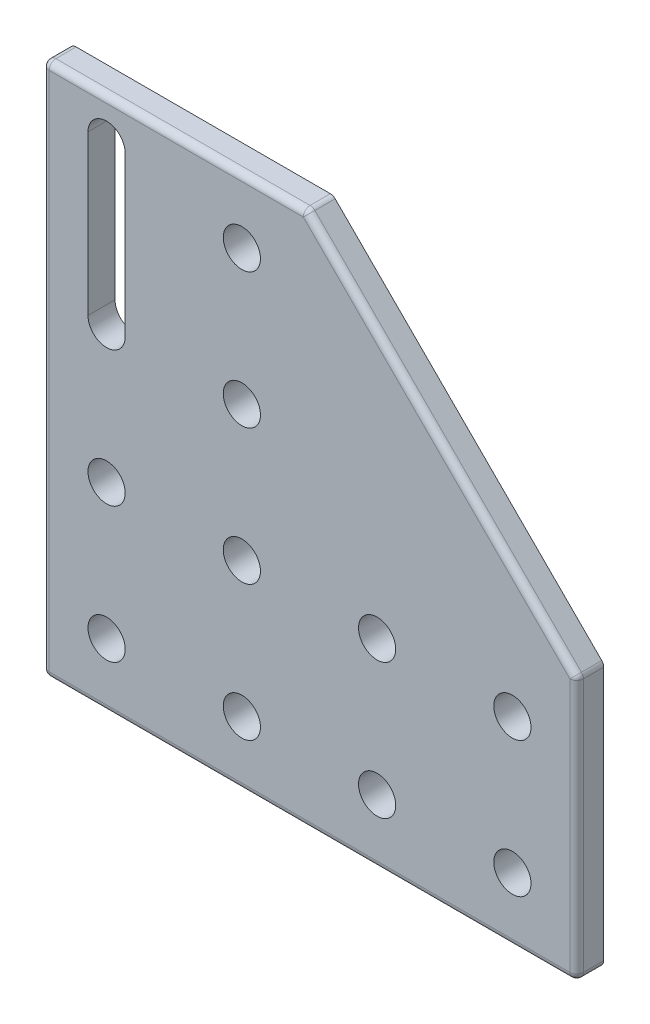
ISO-10303-21;
HEADER;
FILE_DESCRIPTION(('STEP AP214'),'2;1');
FILE_NAME('part.step','',(''),(''),'','','');
FILE_SCHEMA(('AUTOMOTIVE_DESIGN { 1 0 10303 214 1 1 1 1 }'));
ENDSEC;
DATA;
#1=APPLICATION_CONTEXT('core data for automotive mechanical design processes');
#2=APPLICATION_PROTOCOL_DEFINITION('international standard','automotive_design',2000,#1);
#3=PRODUCT_CONTEXT('',#1,'mechanical');
#4=PRODUCT('Part','Part','',(#3));
#5=PRODUCT_RELATED_PRODUCT_CATEGORY('part','',(#4));
#6=PRODUCT_DEFINITION_FORMATION('','',#4);
#7=PRODUCT_DEFINITION_CONTEXT('part definition',#1,'design');
#8=PRODUCT_DEFINITION('design','',#6,#7);
#9=PRODUCT_DEFINITION_SHAPE('','',#8);
#10=(LENGTH_UNIT() NAMED_UNIT(*) SI_UNIT(.MILLI.,.METRE.));
#11=(NAMED_UNIT(*) PLANE_ANGLE_UNIT() SI_UNIT($,.RADIAN.));
#12=(NAMED_UNIT(*) SI_UNIT($,.STERADIAN.) SOLID_ANGLE_UNIT());
#13=UNCERTAINTY_MEASURE_WITH_UNIT(LENGTH_MEASURE(1.E-05),#10,'distance_accuracy_value','');
#14=(GEOMETRIC_REPRESENTATION_CONTEXT(3) GLOBAL_UNCERTAINTY_ASSIGNED_CONTEXT((#13)) GLOBAL_UNIT_ASSIGNED_CONTEXT((#10,
#11,#12)) REPRESENTATION_CONTEXT('',''));
#15=CARTESIAN_POINT('',(0.,0.,0.));
#16=DIRECTION('',(0.,0.,1.));
#17=DIRECTION('',(1.,0.,0.));
#18=AXIS2_PLACEMENT_3D('',#15,#16,#17);
#19=CARTESIAN_POINT('',(0.,0.,2.));
#20=DIRECTION('',(0.,0.,-1.));
#21=DIRECTION('',(-1.,0.,0.));
#22=AXIS2_PLACEMENT_3D('',#19,#20,#21);
#23=PLANE('',#22);
#24=DIRECTION('',(0.,-1.,0.));
#25=VECTOR('',#24,1.);
#26=CARTESIAN_POINT('',(1.,0.,2.));
#27=LINE('',#26,#25);
#28=CARTESIAN_POINT('',(1.,78.,2.));
#29=VERTEX_POINT('',#28);
#30=CARTESIAN_POINT('',(1.,1.,2.));
#31=VERTEX_POINT('',#30);
#32=EDGE_CURVE('E287',#29,#31,#27,.T.);
#33=ORIENTED_EDGE('',*,*,#32,.T.);
#34=DIRECTION('',(1.,0.,0.));
#35=VECTOR('',#34,1.);
#36=CARTESIAN_POINT('',(0.,1.,2.));
#37=LINE('',#36,#35);
#38=CARTESIAN_POINT('',(78.,1.,2.));
#39=VERTEX_POINT('',#38);
#40=EDGE_CURVE('E294',#31,#39,#37,.T.);
#41=ORIENTED_EDGE('',*,*,#40,.T.);
#42=DIRECTION('',(0.,1.,0.));
#43=VECTOR('',#42,1.);
#44=CARTESIAN_POINT('',(78.,0.,2.));
#45=LINE('',#44,#43);
#46=CARTESIAN_POINT('',(78.,38.5857864376269,2.));
#47=VERTEX_POINT('',#46);
#48=EDGE_CURVE('E292',#39,#47,#45,.T.);
#49=ORIENTED_EDGE('',*,*,#48,.T.);
#50=DIRECTION('',(-0.707106781186547,0.707106781186548,0.));
#51=VECTOR('',#50,1.);
#52=CARTESIAN_POINT('',(58.2928932188135,58.2928932188134,2.));
#53=LINE('',#52,#51);
#54=CARTESIAN_POINT('',(38.5857864376269,78.,2.));
#55=VERTEX_POINT('',#54);
#56=EDGE_CURVE('E289',#47,#55,#53,.T.);
#57=ORIENTED_EDGE('',*,*,#56,.T.);
#58=DIRECTION('',(-1.,0.,0.));
#59=VECTOR('',#58,1.);
#60=CARTESIAN_POINT('',(0.,78.,2.));
#61=LINE('',#60,#59);
#62=EDGE_CURVE('E285',#55,#29,#61,.T.);
#63=ORIENTED_EDGE('',*,*,#62,.T.);
#64=EDGE_LOOP('',(#33,#41,#49,#57,#63));
#65=FACE_BOUND('',#64,.T.);
#66=CARTESIAN_POINT('',(29.5,69.5,2.));
#67=DIRECTION('',(0.,0.,1.));
#68=DIRECTION('',(1.,0.,0.));
#69=AXIS2_PLACEMENT_3D('',#66,#67,#68);
#70=CIRCLE('',#69,2.75);
#71=CARTESIAN_POINT('',(32.25,69.5,2.));
#72=VERTEX_POINT('',#71);
#73=EDGE_CURVE('E189',#72,#72,#70,.T.);
#74=ORIENTED_EDGE('',*,*,#73,.F.);
#75=EDGE_LOOP('',(#74));
#76=FACE_BOUND('',#75,.T.);
#77=CARTESIAN_POINT('',(29.5,49.5,2.));
#78=DIRECTION('',(0.,0.,1.));
#79=DIRECTION('',(1.,0.,0.));
#80=AXIS2_PLACEMENT_3D('',#77,#78,#79);
#81=CIRCLE('',#80,2.75);
#82=CARTESIAN_POINT('',(32.25,49.5,2.));
#83=VERTEX_POINT('',#82);
#84=EDGE_CURVE('E195',#83,#83,#81,.T.);
#85=ORIENTED_EDGE('',*,*,#84,.F.);
#86=EDGE_LOOP('',(#85));
#87=FACE_BOUND('',#86,.T.);
#88=CARTESIAN_POINT('',(29.5,29.5,2.));
#89=DIRECTION('',(0.,0.,1.));
#90=DIRECTION('',(1.,0.,0.));
#91=AXIS2_PLACEMENT_3D('',#88,#89,#90);
#92=CIRCLE('',#91,2.75);
#93=CARTESIAN_POINT('',(32.25,29.5,2.));
#94=VERTEX_POINT('',#93);
#95=EDGE_CURVE('E201',#94,#94,#92,.T.);
#96=ORIENTED_EDGE('',*,*,#95,.F.);
#97=EDGE_LOOP('',(#96));
#98=FACE_BOUND('',#97,.T.);
#99=CARTESIAN_POINT('',(49.5,29.5,2.));
#100=DIRECTION('',(0.,0.,1.));
#101=DIRECTION('',(1.,0.,0.));
#102=AXIS2_PLACEMENT_3D('',#99,#100,#101);
#103=CIRCLE('',#102,2.75);
#104=CARTESIAN_POINT('',(52.25,29.5,2.));
#105=VERTEX_POINT('',#104);
#106=EDGE_CURVE('E207',#105,#105,#103,.T.);
#107=ORIENTED_EDGE('',*,*,#106,.F.);
#108=EDGE_LOOP('',(#107));
#109=FACE_BOUND('',#108,.T.);
#110=CARTESIAN_POINT('',(69.5,29.5,2.));
#111=DIRECTION('',(0.,0.,1.));
#112=DIRECTION('',(1.,0.,0.));
#113=AXIS2_PLACEMENT_3D('',#110,#111,#112);
#114=CIRCLE('',#113,2.75000000000001);
#115=CARTESIAN_POINT('',(72.25,29.5,2.));
#116=VERTEX_POINT('',#115);
#117=EDGE_CURVE('E213',#116,#116,#114,.T.);
#118=ORIENTED_EDGE('',*,*,#117,.F.);
#119=EDGE_LOOP('',(#118));
#120=FACE_BOUND('',#119,.T.);
#121=CARTESIAN_POINT('',(69.5,9.49999999999999,2.));
#122=DIRECTION('',(0.,0.,1.));
#123=DIRECTION('',(1.,0.,0.));
#124=AXIS2_PLACEMENT_3D('',#121,#122,#123);
#125=CIRCLE('',#124,2.75000000000001);
#126=CARTESIAN_POINT('',(72.25,9.49999999999999,2.));
#127=VERTEX_POINT('',#126);
#128=EDGE_CURVE('E219',#127,#127,#125,.T.);
#129=ORIENTED_EDGE('',*,*,#128,.F.);
#130=EDGE_LOOP('',(#129));
#131=FACE_BOUND('',#130,.T.);
#132=CARTESIAN_POINT('',(9.5,29.5,2.));
#133=DIRECTION('',(0.,0.,1.));
#134=DIRECTION('',(1.,0.,0.));
#135=AXIS2_PLACEMENT_3D('',#132,#133,#134);
#136=CIRCLE('',#135,2.75000000000001);
#137=CARTESIAN_POINT('',(12.25,29.5,2.));
#138=VERTEX_POINT('',#137);
#139=EDGE_CURVE('E225',#138,#138,#136,.T.);
#140=ORIENTED_EDGE('',*,*,#139,.F.);
#141=EDGE_LOOP('',(#140));
#142=FACE_BOUND('',#141,.T.);
#143=CARTESIAN_POINT('',(49.5,9.49999999999999,2.));
#144=DIRECTION('',(0.,0.,1.));
#145=DIRECTION('',(1.,0.,0.));
#146=AXIS2_PLACEMENT_3D('',#143,#144,#145);
#147=CIRCLE('',#146,2.75000000000001);
#148=CARTESIAN_POINT('',(52.25,9.49999999999999,2.));
#149=VERTEX_POINT('',#148);
#150=EDGE_CURVE('E231',#149,#149,#147,.T.);
#151=ORIENTED_EDGE('',*,*,#150,.F.);
#152=EDGE_LOOP('',(#151));
#153=FACE_BOUND('',#152,.T.);
#154=CARTESIAN_POINT('',(29.5,9.49999999999999,2.));
#155=DIRECTION('',(0.,0.,1.));
#156=DIRECTION('',(1.,0.,0.));
#157=AXIS2_PLACEMENT_3D('',#154,#155,#156);
#158=CIRCLE('',#157,2.75);
#159=CARTESIAN_POINT('',(32.25,9.49999999999999,2.));
#160=VERTEX_POINT('',#159);
#161=EDGE_CURVE('E237',#160,#160,#158,.T.);
#162=ORIENTED_EDGE('',*,*,#161,.F.);
#163=EDGE_LOOP('',(#162));
#164=FACE_BOUND('',#163,.T.);
#165=CARTESIAN_POINT('',(9.5,9.49999999999999,2.));
#166=DIRECTION('',(0.,0.,1.));
#167=DIRECTION('',(1.,0.,0.));
#168=AXIS2_PLACEMENT_3D('',#165,#166,#167);
#169=CIRCLE('',#168,2.75);
#170=CARTESIAN_POINT('',(12.25,9.49999999999999,2.));
#171=VERTEX_POINT('',#170);
#172=EDGE_CURVE('E243',#171,#171,#169,.T.);
#173=ORIENTED_EDGE('',*,*,#172,.F.);
#174=EDGE_LOOP('',(#173));
#175=FACE_BOUND('',#174,.T.);
#176=CARTESIAN_POINT('',(9.5,73.,2.));
#177=DIRECTION('',(0.,0.,1.));
#178=DIRECTION('',(1.,0.,0.));
#179=AXIS2_PLACEMENT_3D('',#176,#177,#178);
#180=CIRCLE('',#179,2.75);
#181=CARTESIAN_POINT('',(12.25,73.,2.));
#182=VERTEX_POINT('',#181);
#183=CARTESIAN_POINT('',(6.75,73.,2.));
#184=VERTEX_POINT('',#183);
#185=EDGE_CURVE('E148',#182,#184,#180,.T.);
#186=ORIENTED_EDGE('',*,*,#185,.F.);
#187=DIRECTION('',(0.,1.,0.));
#188=VECTOR('',#187,1.);
#189=CARTESIAN_POINT('',(12.25,73.,2.));
#190=LINE('',#189,#188);
#191=CARTESIAN_POINT('',(12.25,49.5,2.));
#192=VERTEX_POINT('',#191);
#193=EDGE_CURVE('E173',#192,#182,#190,.T.);
#194=ORIENTED_EDGE('',*,*,#193,.F.);
#195=CARTESIAN_POINT('',(9.50000000000001,49.5,2.));
#196=DIRECTION('',(0.,0.,1.));
#197=DIRECTION('',(1.,0.,0.));
#198=AXIS2_PLACEMENT_3D('',#195,#196,#197);
#199=CIRCLE('',#198,2.75);
#200=CARTESIAN_POINT('',(6.75000000000001,49.5,2.));
#201=VERTEX_POINT('',#200);
#202=EDGE_CURVE('E171',#201,#192,#199,.T.);
#203=ORIENTED_EDGE('',*,*,#202,.F.);
#204=DIRECTION('',(0.,-1.,0.));
#205=VECTOR('',#204,1.);
#206=CARTESIAN_POINT('',(6.75,73.,2.));
#207=LINE('',#206,#205);
#208=EDGE_CURVE('E158',#184,#201,#207,.T.);
#209=ORIENTED_EDGE('',*,*,#208,.F.);
#210=EDGE_LOOP('',(#186,#194,#203,#209));
#211=FACE_BOUND('',#210,.T.);
#212=ADVANCED_FACE('F33',(#65,#76,#87,#98,#109,#120,#131,#142,#153,#164,#175,#211),#23,.F.);
#213=CARTESIAN_POINT('',(0.,0.,-2.));
#214=DIRECTION('',(0.,0.,-1.));
#215=DIRECTION('',(-1.,0.,0.));
#216=AXIS2_PLACEMENT_3D('',#213,#214,#215);
#217=PLANE('',#216);
#218=CARTESIAN_POINT('',(29.5,49.5,-2.));
#219=DIRECTION('',(0.,0.,1.));
#220=DIRECTION('',(1.,0.,0.));
#221=AXIS2_PLACEMENT_3D('',#218,#219,#220);
#222=CIRCLE('',#221,2.75);
#223=CARTESIAN_POINT('',(32.25,49.5,-2.));
#224=VERTEX_POINT('',#223);
#225=EDGE_CURVE('E192',#224,#224,#222,.T.);
#226=ORIENTED_EDGE('',*,*,#225,.T.);
#227=EDGE_LOOP('',(#226));
#228=FACE_BOUND('',#227,.T.);
#229=CARTESIAN_POINT('',(49.5,29.5,-2.));
#230=DIRECTION('',(0.,0.,1.));
#231=DIRECTION('',(1.,0.,0.));
#232=AXIS2_PLACEMENT_3D('',#229,#230,#231);
#233=CIRCLE('',#232,2.75);
#234=CARTESIAN_POINT('',(52.25,29.5,-2.));
#235=VERTEX_POINT('',#234);
#236=EDGE_CURVE('E204',#235,#235,#233,.T.);
#237=ORIENTED_EDGE('',*,*,#236,.T.);
#238=EDGE_LOOP('',(#237));
#239=FACE_BOUND('',#238,.T.);
#240=CARTESIAN_POINT('',(69.5,9.49999999999999,-2.));
#241=DIRECTION('',(0.,0.,1.));
#242=DIRECTION('',(1.,0.,0.));
#243=AXIS2_PLACEMENT_3D('',#240,#241,#242);
#244=CIRCLE('',#243,2.75000000000001);
#245=CARTESIAN_POINT('',(72.25,9.49999999999999,-2.));
#246=VERTEX_POINT('',#245);
#247=EDGE_CURVE('E216',#246,#246,#244,.T.);
#248=ORIENTED_EDGE('',*,*,#247,.T.);
#249=EDGE_LOOP('',(#248));
#250=FACE_BOUND('',#249,.T.);
#251=CARTESIAN_POINT('',(49.5,9.49999999999999,-2.));
#252=DIRECTION('',(0.,0.,1.));
#253=DIRECTION('',(1.,0.,0.));
#254=AXIS2_PLACEMENT_3D('',#251,#252,#253);
#255=CIRCLE('',#254,2.75000000000001);
#256=CARTESIAN_POINT('',(52.25,9.49999999999999,-2.));
#257=VERTEX_POINT('',#256);
#258=EDGE_CURVE('E228',#257,#257,#255,.T.);
#259=ORIENTED_EDGE('',*,*,#258,.T.);
#260=EDGE_LOOP('',(#259));
#261=FACE_BOUND('',#260,.T.);
#262=CARTESIAN_POINT('',(9.5,9.49999999999999,-2.));
#263=DIRECTION('',(0.,0.,1.));
#264=DIRECTION('',(1.,0.,0.));
#265=AXIS2_PLACEMENT_3D('',#262,#263,#264);
#266=CIRCLE('',#265,2.75);
#267=CARTESIAN_POINT('',(12.25,9.49999999999999,-2.));
#268=VERTEX_POINT('',#267);
#269=EDGE_CURVE('E240',#268,#268,#266,.T.);
#270=ORIENTED_EDGE('',*,*,#269,.T.);
#271=EDGE_LOOP('',(#270));
#272=FACE_BOUND('',#271,.T.);
#273=DIRECTION('',(-0.707106781186547,0.707106781186548,0.));
#274=VECTOR('',#273,1.);
#275=CARTESIAN_POINT('',(39.,79.,-2.));
#276=LINE('',#275,#274);
#277=CARTESIAN_POINT('',(78.7071067811865,39.2928932188134,-2.));
#278=VERTEX_POINT('',#277);
#279=CARTESIAN_POINT('',(39.2928932188134,78.7071067811865,-2.));
#280=VERTEX_POINT('',#279);
#281=EDGE_CURVE('E254',#278,#280,#276,.T.);
#282=ORIENTED_EDGE('',*,*,#281,.F.);
#283=CARTESIAN_POINT('',(78.,38.5857864376269,-2.));
#284=DIRECTION('',(0.,0.,-1.));
#285=DIRECTION('',(-1.,0.,0.));
#286=AXIS2_PLACEMENT_3D('',#283,#284,#285);
#287=CIRCLE('',#286,1.);
#288=CARTESIAN_POINT('',(79.,38.5857864376269,-2.));
#289=VERTEX_POINT('',#288);
#290=EDGE_CURVE('E277',#278,#289,#287,.T.);
#291=ORIENTED_EDGE('',*,*,#290,.T.);
#292=DIRECTION('',(0.,1.,0.));
#293=VECTOR('',#292,1.);
#294=CARTESIAN_POINT('',(79.,39.,-2.));
#295=LINE('',#294,#293);
#296=CARTESIAN_POINT('',(79.,1.,-2.));
#297=VERTEX_POINT('',#296);
#298=EDGE_CURVE('E251',#297,#289,#295,.T.);
#299=ORIENTED_EDGE('',*,*,#298,.F.);
#300=CARTESIAN_POINT('',(78.,1.,-2.));
#301=DIRECTION('',(0.,0.,-1.));
#302=DIRECTION('',(-1.,0.,0.));
#303=AXIS2_PLACEMENT_3D('',#300,#301,#302);
#304=CIRCLE('',#303,1.);
#305=CARTESIAN_POINT('',(78.,0.,-2.));
#306=VERTEX_POINT('',#305);
#307=EDGE_CURVE('E271',#297,#306,#304,.T.);
#308=ORIENTED_EDGE('',*,*,#307,.T.);
#309=DIRECTION('',(1.,0.,0.));
#310=VECTOR('',#309,1.);
#311=CARTESIAN_POINT('',(79.,0.,-2.));
#312=LINE('',#311,#310);
#313=CARTESIAN_POINT('',(1.,0.,-2.));
#314=VERTEX_POINT('',#313);
#315=EDGE_CURVE('E246',#314,#306,#312,.T.);
#316=ORIENTED_EDGE('',*,*,#315,.F.);
#317=CARTESIAN_POINT('',(1.,1.,-2.));
#318=DIRECTION('',(0.,0.,-1.));
#319=DIRECTION('',(-1.,0.,0.));
#320=AXIS2_PLACEMENT_3D('',#317,#318,#319);
#321=CIRCLE('',#320,1.);
#322=CARTESIAN_POINT('',(0.,1.,-2.));
#323=VERTEX_POINT('',#322);
#324=EDGE_CURVE('E273',#314,#323,#321,.T.);
#325=ORIENTED_EDGE('',*,*,#324,.T.);
#326=DIRECTION('',(0.,-1.,0.));
#327=VECTOR('',#326,1.);
#328=CARTESIAN_POINT('',(0.,0.,-2.));
#329=LINE('',#328,#327);
#330=CARTESIAN_POINT('',(0.,78.,-2.));
#331=VERTEX_POINT('',#330);
#332=EDGE_CURVE('E260',#331,#323,#329,.T.);
#333=ORIENTED_EDGE('',*,*,#332,.F.);
#334=CARTESIAN_POINT('',(1.,78.,-2.));
#335=DIRECTION('',(0.,0.,-1.));
#336=DIRECTION('',(-1.,0.,0.));
#337=AXIS2_PLACEMENT_3D('',#334,#335,#336);
#338=CIRCLE('',#337,1.);
#339=CARTESIAN_POINT('',(1.,79.,-2.));
#340=VERTEX_POINT('',#339);
#341=EDGE_CURVE('E269',#331,#340,#338,.T.);
#342=ORIENTED_EDGE('',*,*,#341,.T.);
#343=DIRECTION('',(-1.,0.,0.));
#344=VECTOR('',#343,1.);
#345=CARTESIAN_POINT('',(39.,79.,-2.));
#346=LINE('',#345,#344);
#347=CARTESIAN_POINT('',(38.5857864376269,79.,-2.));
#348=VERTEX_POINT('',#347);
#349=EDGE_CURVE('E257',#348,#340,#346,.T.);
#350=ORIENTED_EDGE('',*,*,#349,.F.);
#351=CARTESIAN_POINT('',(38.5857864376269,78.,-2.));
#352=DIRECTION('',(0.,0.,-1.));
#353=DIRECTION('',(-1.,0.,0.));
#354=AXIS2_PLACEMENT_3D('',#351,#352,#353);
#355=CIRCLE('',#354,1.);
#356=EDGE_CURVE('E275',#348,#280,#355,.T.);
#357=ORIENTED_EDGE('',*,*,#356,.T.);
#358=EDGE_LOOP('',(#282,#291,#299,#308,#316,#325,#333,#342,#350,#357));
#359=FACE_BOUND('',#358,.T.);
#360=CARTESIAN_POINT('',(29.5,9.49999999999999,-2.));
#361=DIRECTION('',(0.,0.,1.));
#362=DIRECTION('',(1.,0.,0.));
#363=AXIS2_PLACEMENT_3D('',#360,#361,#362);
#364=CIRCLE('',#363,2.75);
#365=CARTESIAN_POINT('',(32.25,9.49999999999999,-2.));
#366=VERTEX_POINT('',#365);
#367=EDGE_CURVE('E234',#366,#366,#364,.T.);
#368=ORIENTED_EDGE('',*,*,#367,.T.);
#369=EDGE_LOOP('',(#368));
#370=FACE_BOUND('',#369,.T.);
#371=CARTESIAN_POINT('',(9.5,29.5,-2.));
#372=DIRECTION('',(0.,0.,1.));
#373=DIRECTION('',(1.,0.,0.));
#374=AXIS2_PLACEMENT_3D('',#371,#372,#373);
#375=CIRCLE('',#374,2.75000000000001);
#376=CARTESIAN_POINT('',(12.25,29.5,-2.));
#377=VERTEX_POINT('',#376);
#378=EDGE_CURVE('E222',#377,#377,#375,.T.);
#379=ORIENTED_EDGE('',*,*,#378,.T.);
#380=EDGE_LOOP('',(#379));
#381=FACE_BOUND('',#380,.T.);
#382=CARTESIAN_POINT('',(69.5,29.5,-2.));
#383=DIRECTION('',(0.,0.,1.));
#384=DIRECTION('',(1.,0.,0.));
#385=AXIS2_PLACEMENT_3D('',#382,#383,#384);
#386=CIRCLE('',#385,2.75000000000001);
#387=CARTESIAN_POINT('',(72.25,29.5,-2.));
#388=VERTEX_POINT('',#387);
#389=EDGE_CURVE('E210',#388,#388,#386,.T.);
#390=ORIENTED_EDGE('',*,*,#389,.T.);
#391=EDGE_LOOP('',(#390));
#392=FACE_BOUND('',#391,.T.);
#393=CARTESIAN_POINT('',(29.5,29.5,-2.));
#394=DIRECTION('',(0.,0.,1.));
#395=DIRECTION('',(1.,0.,0.));
#396=AXIS2_PLACEMENT_3D('',#393,#394,#395);
#397=CIRCLE('',#396,2.75);
#398=CARTESIAN_POINT('',(32.25,29.5,-2.));
#399=VERTEX_POINT('',#398);
#400=EDGE_CURVE('E198',#399,#399,#397,.T.);
#401=ORIENTED_EDGE('',*,*,#400,.T.);
#402=EDGE_LOOP('',(#401));
#403=FACE_BOUND('',#402,.T.);
#404=CARTESIAN_POINT('',(29.5,69.5,-2.));
#405=DIRECTION('',(0.,0.,1.));
#406=DIRECTION('',(1.,0.,0.));
#407=AXIS2_PLACEMENT_3D('',#404,#405,#406);
#408=CIRCLE('',#407,2.75);
#409=CARTESIAN_POINT('',(32.25,69.5,-2.));
#410=VERTEX_POINT('',#409);
#411=EDGE_CURVE('E166',#410,#410,#408,.T.);
#412=ORIENTED_EDGE('',*,*,#411,.T.);
#413=EDGE_LOOP('',(#412));
#414=FACE_BOUND('',#413,.T.);
#415=DIRECTION('',(0.,1.,0.));
#416=VECTOR('',#415,1.);
#417=CARTESIAN_POINT('',(12.25,73.,-2.));
#418=LINE('',#417,#416);
#419=CARTESIAN_POINT('',(12.25,49.5,-2.));
#420=VERTEX_POINT('',#419);
#421=CARTESIAN_POINT('',(12.25,73.,-2.));
#422=VERTEX_POINT('',#421);
#423=EDGE_CURVE('E159',#420,#422,#418,.T.);
#424=ORIENTED_EDGE('',*,*,#423,.T.);
#425=CARTESIAN_POINT('',(9.5,73.,-2.));
#426=DIRECTION('',(0.,0.,1.));
#427=DIRECTION('',(1.,0.,0.));
#428=AXIS2_PLACEMENT_3D('',#425,#426,#427);
#429=CIRCLE('',#428,2.75);
#430=CARTESIAN_POINT('',(6.75,73.,-2.));
#431=VERTEX_POINT('',#430);
#432=EDGE_CURVE('E177',#422,#431,#429,.T.);
#433=ORIENTED_EDGE('',*,*,#432,.T.);
#434=DIRECTION('',(0.,-1.,0.));
#435=VECTOR('',#434,1.);
#436=CARTESIAN_POINT('',(6.75,73.,-2.));
#437=LINE('',#436,#435);
#438=CARTESIAN_POINT('',(6.75000000000001,49.5,-2.));
#439=VERTEX_POINT('',#438);
#440=EDGE_CURVE('E165',#431,#439,#437,.T.);
#441=ORIENTED_EDGE('',*,*,#440,.T.);
#442=CARTESIAN_POINT('',(9.50000000000001,49.5,-2.));
#443=DIRECTION('',(0.,0.,1.));
#444=DIRECTION('',(1.,0.,0.));
#445=AXIS2_PLACEMENT_3D('',#442,#443,#444);
#446=CIRCLE('',#445,2.75);
#447=EDGE_CURVE('E180',#439,#420,#446,.T.);
#448=ORIENTED_EDGE('',*,*,#447,.T.);
#449=EDGE_LOOP('',(#424,#433,#441,#448));
#450=FACE_BOUND('',#449,.T.);
#451=ADVANCED_FACE('F387',(#228,#239,#250,#261,#272,#359,#370,#381,#392,#403,#414,#450),#217,.T.);
#452=CARTESIAN_POINT('',(79.,0.,2.));
#453=DIRECTION('',(0.,1.,0.));
#454=DIRECTION('',(-1.,0.,0.));
#455=AXIS2_PLACEMENT_3D('',#452,#453,#454);
#456=PLANE('',#455);
#457=DIRECTION('',(1.,0.,0.));
#458=VECTOR('',#457,1.);
#459=CARTESIAN_POINT('',(79.,0.,1.));
#460=LINE('',#459,#458);
#461=CARTESIAN_POINT('',(78.,0.,1.));
#462=VERTEX_POINT('',#461);
#463=CARTESIAN_POINT('',(1.,0.,1.));
#464=VERTEX_POINT('',#463);
#465=EDGE_CURVE('E304',#462,#464,#460,.F.);
#466=ORIENTED_EDGE('',*,*,#465,.T.);
#467=DIRECTION('',(0.,0.,-1.));
#468=VECTOR('',#467,1.);
#469=CARTESIAN_POINT('',(1.,0.,2.));
#470=LINE('',#469,#468);
#471=EDGE_CURVE('E306',#464,#314,#470,.T.);
#472=ORIENTED_EDGE('',*,*,#471,.T.);
#473=ORIENTED_EDGE('',*,*,#315,.T.);
#474=DIRECTION('',(0.,0.,-1.));
#475=VECTOR('',#474,1.);
#476=CARTESIAN_POINT('',(78.,0.,2.));
#477=LINE('',#476,#475);
#478=EDGE_CURVE('E302',#306,#462,#477,.F.);
#479=ORIENTED_EDGE('',*,*,#478,.T.);
#480=EDGE_LOOP('',(#466,#472,#473,#479));
#481=FACE_BOUND('',#480,.T.);
#482=ADVANCED_FACE('F393',(#481),#456,.F.);
#483=CARTESIAN_POINT('',(79.,39.,2.));
#484=DIRECTION('',(-1.,0.,0.));
#485=DIRECTION('',(0.,0.,1.));
#486=AXIS2_PLACEMENT_3D('',#483,#484,#485);
#487=PLANE('',#486);
#488=ORIENTED_EDGE('',*,*,#298,.T.);
#489=DIRECTION('',(0.,0.,-1.));
#490=VECTOR('',#489,1.);
#491=CARTESIAN_POINT('',(79.,38.5857864376269,2.));
#492=LINE('',#491,#490);
#493=CARTESIAN_POINT('',(79.,38.5857864376269,1.));
#494=VERTEX_POINT('',#493);
#495=EDGE_CURVE('E283',#289,#494,#492,.F.);
#496=ORIENTED_EDGE('',*,*,#495,.T.);
#497=DIRECTION('',(0.,1.,0.));
#498=VECTOR('',#497,1.);
#499=CARTESIAN_POINT('',(79.,39.,1.));
#500=LINE('',#499,#498);
#501=CARTESIAN_POINT('',(79.,1.,1.));
#502=VERTEX_POINT('',#501);
#503=EDGE_CURVE('E281',#494,#502,#500,.F.);
#504=ORIENTED_EDGE('',*,*,#503,.T.);
#505=DIRECTION('',(0.,0.,-1.));
#506=VECTOR('',#505,1.);
#507=CARTESIAN_POINT('',(79.,1.,2.));
#508=LINE('',#507,#506);
#509=EDGE_CURVE('E279',#502,#297,#508,.T.);
#510=ORIENTED_EDGE('',*,*,#509,.T.);
#511=EDGE_LOOP('',(#488,#496,#504,#510));
#512=FACE_BOUND('',#511,.T.);
#513=ADVANCED_FACE('F434',(#512),#487,.F.);
#514=CARTESIAN_POINT('',(39.,79.,2.));
#515=DIRECTION('',(-0.707106781186548,-0.707106781186547,0.));
#516=DIRECTION('',(0.707106781186547,-0.707106781186548,0.));
#517=AXIS2_PLACEMENT_3D('',#514,#515,#516);
#518=PLANE('',#517);
#519=DIRECTION('',(-0.707106781186547,0.707106781186548,0.));
#520=VECTOR('',#519,1.);
#521=CARTESIAN_POINT('',(39.,79.,1.));
#522=LINE('',#521,#520);
#523=CARTESIAN_POINT('',(39.2928932188134,78.7071067811865,1.));
#524=VERTEX_POINT('',#523);
#525=CARTESIAN_POINT('',(78.7071067811865,39.2928932188134,1.));
#526=VERTEX_POINT('',#525);
#527=EDGE_CURVE('E264',#524,#526,#522,.F.);
#528=ORIENTED_EDGE('',*,*,#527,.T.);
#529=DIRECTION('',(0.,0.,-1.));
#530=VECTOR('',#529,1.);
#531=CARTESIAN_POINT('',(78.7071067811865,39.2928932188134,2.));
#532=LINE('',#531,#530);
#533=EDGE_CURVE('E266',#526,#278,#532,.T.);
#534=ORIENTED_EDGE('',*,*,#533,.T.);
#535=ORIENTED_EDGE('',*,*,#281,.T.);
#536=DIRECTION('',(0.,0.,-1.));
#537=VECTOR('',#536,1.);
#538=CARTESIAN_POINT('',(39.2928932188134,78.7071067811865,2.));
#539=LINE('',#538,#537);
#540=EDGE_CURVE('E262',#280,#524,#539,.F.);
#541=ORIENTED_EDGE('',*,*,#540,.T.);
#542=EDGE_LOOP('',(#528,#534,#535,#541));
#543=FACE_BOUND('',#542,.T.);
#544=ADVANCED_FACE('F428',(#543),#518,.F.);
#545=CARTESIAN_POINT('',(39.,79.,2.));
#546=DIRECTION('',(0.,-1.,0.));
#547=DIRECTION('',(0.,0.,-1.));
#548=AXIS2_PLACEMENT_3D('',#545,#546,#547);
#549=PLANE('',#548);
#550=DIRECTION('',(-1.,0.,0.));
#551=VECTOR('',#550,1.);
#552=CARTESIAN_POINT('',(39.,79.,1.));
#553=LINE('',#552,#551);
#554=CARTESIAN_POINT('',(1.,79.,1.));
#555=VERTEX_POINT('',#554);
#556=CARTESIAN_POINT('',(38.5857864376269,79.,1.));
#557=VERTEX_POINT('',#556);
#558=EDGE_CURVE('E298',#555,#557,#553,.F.);
#559=ORIENTED_EDGE('',*,*,#558,.T.);
#560=DIRECTION('',(0.,0.,-1.));
#561=VECTOR('',#560,1.);
#562=CARTESIAN_POINT('',(38.5857864376269,79.,2.));
#563=LINE('',#562,#561);
#564=EDGE_CURVE('E300',#557,#348,#563,.T.);
#565=ORIENTED_EDGE('',*,*,#564,.T.);
#566=ORIENTED_EDGE('',*,*,#349,.T.);
#567=DIRECTION('',(0.,0.,-1.));
#568=VECTOR('',#567,1.);
#569=CARTESIAN_POINT('',(1.,79.,2.));
#570=LINE('',#569,#568);
#571=EDGE_CURVE('E296',#340,#555,#570,.F.);
#572=ORIENTED_EDGE('',*,*,#571,.T.);
#573=EDGE_LOOP('',(#559,#565,#566,#572));
#574=FACE_BOUND('',#573,.T.);
#575=ADVANCED_FACE('F422',(#574),#549,.F.);
#576=CARTESIAN_POINT('',(0.,0.,2.));
#577=DIRECTION('',(1.,0.,0.));
#578=DIRECTION('',(0.,0.,-1.));
#579=AXIS2_PLACEMENT_3D('',#576,#577,#578);
#580=PLANE('',#579);
#581=ORIENTED_EDGE('',*,*,#332,.T.);
#582=DIRECTION('',(0.,0.,-1.));
#583=VECTOR('',#582,1.);
#584=CARTESIAN_POINT('',(0.,1.,2.));
#585=LINE('',#584,#583);
#586=CARTESIAN_POINT('',(0.,1.,1.));
#587=VERTEX_POINT('',#586);
#588=EDGE_CURVE('E11',#323,#587,#585,.F.);
#589=ORIENTED_EDGE('',*,*,#588,.T.);
#590=DIRECTION('',(0.,-1.,0.));
#591=VECTOR('',#590,1.);
#592=CARTESIAN_POINT('',(0.,0.,1.));
#593=LINE('',#592,#591);
#594=CARTESIAN_POINT('',(0.,78.,1.));
#595=VERTEX_POINT('',#594);
#596=EDGE_CURVE('E42',#587,#595,#593,.F.);
#597=ORIENTED_EDGE('',*,*,#596,.T.);
#598=DIRECTION('',(0.,0.,-1.));
#599=VECTOR('',#598,1.);
#600=CARTESIAN_POINT('',(0.,78.,2.));
#601=LINE('',#600,#599);
#602=EDGE_CURVE('E308',#595,#331,#601,.T.);
#603=ORIENTED_EDGE('',*,*,#602,.T.);
#604=EDGE_LOOP('',(#581,#589,#597,#603));
#605=FACE_BOUND('',#604,.T.);
#606=ADVANCED_FACE('F384',(#605),#580,.F.);
#607=CARTESIAN_POINT('',(9.5,9.49999999999999,2.));
#608=DIRECTION('',(0.,0.,-1.));
#609=DIRECTION('',(-1.,0.,0.));
#610=AXIS2_PLACEMENT_3D('',#607,#608,#609);
#611=CYLINDRICAL_SURFACE('',#610,2.75);
#612=ORIENTED_EDGE('',*,*,#172,.T.);
#613=EDGE_LOOP('',(#612));
#614=FACE_BOUND('',#613,.T.);
#615=ORIENTED_EDGE('',*,*,#269,.F.);
#616=EDGE_LOOP('',(#615));
#617=FACE_BOUND('',#616,.T.);
#618=ADVANCED_FACE('F451',(#614,#617),#611,.F.);
#619=CARTESIAN_POINT('',(29.5,9.49999999999999,2.));
#620=DIRECTION('',(0.,0.,-1.));
#621=DIRECTION('',(-1.,0.,0.));
#622=AXIS2_PLACEMENT_3D('',#619,#620,#621);
#623=CYLINDRICAL_SURFACE('',#622,2.75);
#624=ORIENTED_EDGE('',*,*,#161,.T.);
#625=EDGE_LOOP('',(#624));
#626=FACE_BOUND('',#625,.T.);
#627=ORIENTED_EDGE('',*,*,#367,.F.);
#628=EDGE_LOOP('',(#627));
#629=FACE_BOUND('',#628,.T.);
#630=ADVANCED_FACE('F472',(#626,#629),#623,.F.);
#631=CARTESIAN_POINT('',(49.5,9.49999999999999,2.));
#632=DIRECTION('',(0.,0.,-1.));
#633=DIRECTION('',(-1.,0.,0.));
#634=AXIS2_PLACEMENT_3D('',#631,#632,#633);
#635=CYLINDRICAL_SURFACE('',#634,2.75000000000001);
#636=ORIENTED_EDGE('',*,*,#150,.T.);
#637=EDGE_LOOP('',(#636));
#638=FACE_BOUND('',#637,.T.);
#639=ORIENTED_EDGE('',*,*,#258,.F.);
#640=EDGE_LOOP('',(#639));
#641=FACE_BOUND('',#640,.T.);
#642=ADVANCED_FACE('F479',(#638,#641),#635,.F.);
#643=CARTESIAN_POINT('',(9.5,29.5,2.));
#644=DIRECTION('',(0.,0.,-1.));
#645=DIRECTION('',(-1.,0.,0.));
#646=AXIS2_PLACEMENT_3D('',#643,#644,#645);
#647=CYLINDRICAL_SURFACE('',#646,2.75000000000001);
#648=ORIENTED_EDGE('',*,*,#139,.T.);
#649=EDGE_LOOP('',(#648));
#650=FACE_BOUND('',#649,.T.);
#651=ORIENTED_EDGE('',*,*,#378,.F.);
#652=EDGE_LOOP('',(#651));
#653=FACE_BOUND('',#652,.T.);
#654=ADVANCED_FACE('F486',(#650,#653),#647,.F.);
#655=CARTESIAN_POINT('',(69.5,9.49999999999999,2.));
#656=DIRECTION('',(0.,0.,-1.));
#657=DIRECTION('',(-1.,0.,0.));
#658=AXIS2_PLACEMENT_3D('',#655,#656,#657);
#659=CYLINDRICAL_SURFACE('',#658,2.75000000000001);
#660=ORIENTED_EDGE('',*,*,#128,.T.);
#661=EDGE_LOOP('',(#660));
#662=FACE_BOUND('',#661,.T.);
#663=ORIENTED_EDGE('',*,*,#247,.F.);
#664=EDGE_LOOP('',(#663));
#665=FACE_BOUND('',#664,.T.);
#666=ADVANCED_FACE('F494',(#662,#665),#659,.F.);
#667=CARTESIAN_POINT('',(69.5,29.5,2.));
#668=DIRECTION('',(0.,0.,-1.));
#669=DIRECTION('',(-1.,0.,0.));
#670=AXIS2_PLACEMENT_3D('',#667,#668,#669);
#671=CYLINDRICAL_SURFACE('',#670,2.75000000000001);
#672=ORIENTED_EDGE('',*,*,#117,.T.);
#673=EDGE_LOOP('',(#672));
#674=FACE_BOUND('',#673,.T.);
#675=ORIENTED_EDGE('',*,*,#389,.F.);
#676=EDGE_LOOP('',(#675));
#677=FACE_BOUND('',#676,.T.);
#678=ADVANCED_FACE('F502',(#674,#677),#671,.F.);
#679=CARTESIAN_POINT('',(49.5,29.5,2.));
#680=DIRECTION('',(0.,0.,-1.));
#681=DIRECTION('',(-1.,0.,0.));
#682=AXIS2_PLACEMENT_3D('',#679,#680,#681);
#683=CYLINDRICAL_SURFACE('',#682,2.75);
#684=ORIENTED_EDGE('',*,*,#106,.T.);
#685=EDGE_LOOP('',(#684));
#686=FACE_BOUND('',#685,.T.);
#687=ORIENTED_EDGE('',*,*,#236,.F.);
#688=EDGE_LOOP('',(#687));
#689=FACE_BOUND('',#688,.T.);
#690=ADVANCED_FACE('F510',(#686,#689),#683,.F.);
#691=CARTESIAN_POINT('',(29.5,29.5,2.));
#692=DIRECTION('',(0.,0.,-1.));
#693=DIRECTION('',(-1.,0.,0.));
#694=AXIS2_PLACEMENT_3D('',#691,#692,#693);
#695=CYLINDRICAL_SURFACE('',#694,2.75);
#696=ORIENTED_EDGE('',*,*,#95,.T.);
#697=EDGE_LOOP('',(#696));
#698=FACE_BOUND('',#697,.T.);
#699=ORIENTED_EDGE('',*,*,#400,.F.);
#700=EDGE_LOOP('',(#699));
#701=FACE_BOUND('',#700,.T.);
#702=ADVANCED_FACE('F518',(#698,#701),#695,.F.);
#703=CARTESIAN_POINT('',(29.5,49.5,2.));
#704=DIRECTION('',(0.,0.,-1.));
#705=DIRECTION('',(-1.,0.,0.));
#706=AXIS2_PLACEMENT_3D('',#703,#704,#705);
#707=CYLINDRICAL_SURFACE('',#706,2.75);
#708=ORIENTED_EDGE('',*,*,#84,.T.);
#709=EDGE_LOOP('',(#708));
#710=FACE_BOUND('',#709,.T.);
#711=ORIENTED_EDGE('',*,*,#225,.F.);
#712=EDGE_LOOP('',(#711));
#713=FACE_BOUND('',#712,.T.);
#714=ADVANCED_FACE('F526',(#710,#713),#707,.F.);
#715=CARTESIAN_POINT('',(29.5,69.5,2.));
#716=DIRECTION('',(0.,0.,-1.));
#717=DIRECTION('',(-1.,0.,0.));
#718=AXIS2_PLACEMENT_3D('',#715,#716,#717);
#719=CYLINDRICAL_SURFACE('',#718,2.75);
#720=ORIENTED_EDGE('',*,*,#73,.T.);
#721=EDGE_LOOP('',(#720));
#722=FACE_BOUND('',#721,.T.);
#723=ORIENTED_EDGE('',*,*,#411,.F.);
#724=EDGE_LOOP('',(#723));
#725=FACE_BOUND('',#724,.T.);
#726=ADVANCED_FACE('F534',(#722,#725),#719,.F.);
#727=CARTESIAN_POINT('',(9.5,73.,2.));
#728=DIRECTION('',(0.,0.,-1.));
#729=DIRECTION('',(-1.,0.,0.));
#730=AXIS2_PLACEMENT_3D('',#727,#728,#729);
#731=CYLINDRICAL_SURFACE('',#730,2.75);
#732=ORIENTED_EDGE('',*,*,#432,.F.);
#733=DIRECTION('',(0.,0.,-1.));
#734=VECTOR('',#733,1.);
#735=CARTESIAN_POINT('',(12.25,73.,2.));
#736=LINE('',#735,#734);
#737=EDGE_CURVE('E154',#182,#422,#736,.T.);
#738=ORIENTED_EDGE('',*,*,#737,.F.);
#739=ORIENTED_EDGE('',*,*,#185,.T.);
#740=DIRECTION('',(0.,0.,-1.));
#741=VECTOR('',#740,1.);
#742=CARTESIAN_POINT('',(6.75,73.,2.));
#743=LINE('',#742,#741);
#744=EDGE_CURVE('E151',#184,#431,#743,.T.);
#745=ORIENTED_EDGE('',*,*,#744,.T.);
#746=EDGE_LOOP('',(#732,#738,#739,#745));
#747=FACE_BOUND('',#746,.T.);
#748=ADVANCED_FACE('F150',(#747),#731,.F.);
#749=CARTESIAN_POINT('',(6.75,73.,2.));
#750=DIRECTION('',(1.,0.,0.));
#751=DIRECTION('',(0.,1.,0.));
#752=AXIS2_PLACEMENT_3D('',#749,#750,#751);
#753=PLANE('',#752);
#754=ORIENTED_EDGE('',*,*,#440,.F.);
#755=ORIENTED_EDGE('',*,*,#744,.F.);
#756=ORIENTED_EDGE('',*,*,#208,.T.);
#757=DIRECTION('',(0.,0.,-1.));
#758=VECTOR('',#757,1.);
#759=CARTESIAN_POINT('',(6.75000000000001,49.5,2.));
#760=LINE('',#759,#758);
#761=EDGE_CURVE('E167',#201,#439,#760,.T.);
#762=ORIENTED_EDGE('',*,*,#761,.T.);
#763=EDGE_LOOP('',(#754,#755,#756,#762));
#764=FACE_BOUND('',#763,.T.);
#765=ADVANCED_FACE('F162',(#764),#753,.T.);
#766=CARTESIAN_POINT('',(9.50000000000001,49.5,2.));
#767=DIRECTION('',(0.,0.,-1.));
#768=DIRECTION('',(-1.,0.,0.));
#769=AXIS2_PLACEMENT_3D('',#766,#767,#768);
#770=CYLINDRICAL_SURFACE('',#769,2.75);
#771=ORIENTED_EDGE('',*,*,#447,.F.);
#772=ORIENTED_EDGE('',*,*,#761,.F.);
#773=ORIENTED_EDGE('',*,*,#202,.T.);
#774=DIRECTION('',(0.,0.,-1.));
#775=VECTOR('',#774,1.);
#776=CARTESIAN_POINT('',(12.25,49.5,2.));
#777=LINE('',#776,#775);
#778=EDGE_CURVE('E186',#192,#420,#777,.T.);
#779=ORIENTED_EDGE('',*,*,#778,.T.);
#780=EDGE_LOOP('',(#771,#772,#773,#779));
#781=FACE_BOUND('',#780,.T.);
#782=ADVANCED_FACE('F555',(#781),#770,.F.);
#783=CARTESIAN_POINT('',(12.25,73.,2.));
#784=DIRECTION('',(-1.,0.,0.));
#785=DIRECTION('',(0.,-1.,0.));
#786=AXIS2_PLACEMENT_3D('',#783,#784,#785);
#787=PLANE('',#786);
#788=ORIENTED_EDGE('',*,*,#423,.F.);
#789=ORIENTED_EDGE('',*,*,#778,.F.);
#790=ORIENTED_EDGE('',*,*,#193,.T.);
#791=ORIENTED_EDGE('',*,*,#737,.T.);
#792=EDGE_LOOP('',(#788,#789,#790,#791));
#793=FACE_BOUND('',#792,.T.);
#794=ADVANCED_FACE('F562',(#793),#787,.T.);
#795=CARTESIAN_POINT('',(1.,1.,2.));
#796=DIRECTION('',(0.,0.,-1.));
#797=DIRECTION('',(-1.,0.,0.));
#798=AXIS2_PLACEMENT_3D('',#795,#796,#797);
#799=CYLINDRICAL_SURFACE('',#798,1.);
#800=ORIENTED_EDGE('',*,*,#324,.F.);
#801=ORIENTED_EDGE('',*,*,#471,.F.);
#802=CARTESIAN_POINT('',(1.,1.,1.));
#803=DIRECTION('',(0.,0.,1.));
#804=DIRECTION('',(1.,0.,0.));
#805=AXIS2_PLACEMENT_3D('',#802,#803,#804);
#806=CIRCLE('',#805,1.);
#807=EDGE_CURVE('E37',#587,#464,#806,.T.);
#808=ORIENTED_EDGE('',*,*,#807,.F.);
#809=ORIENTED_EDGE('',*,*,#588,.F.);
#810=EDGE_LOOP('',(#800,#801,#808,#809));
#811=FACE_BOUND('',#810,.T.);
#812=ADVANCED_FACE('F35',(#811),#799,.T.);
#813=CARTESIAN_POINT('',(1.,0.,1.));
#814=DIRECTION('',(0.,-1.,0.));
#815=DIRECTION('',(0.,0.,-1.));
#816=AXIS2_PLACEMENT_3D('',#813,#814,#815);
#817=CYLINDRICAL_SURFACE('',#816,1.);
#818=CARTESIAN_POINT('',(1.,78.,1.));
#819=DIRECTION('',(0.,1.,0.));
#820=DIRECTION('',(0.,0.,1.));
#821=AXIS2_PLACEMENT_3D('',#818,#819,#820);
#822=CIRCLE('',#821,1.);
#823=EDGE_CURVE('E346',#595,#29,#822,.T.);
#824=ORIENTED_EDGE('',*,*,#823,.F.);
#825=ORIENTED_EDGE('',*,*,#596,.F.);
#826=CARTESIAN_POINT('',(1.,1.,1.));
#827=DIRECTION('',(0.,-1.,0.));
#828=DIRECTION('',(0.,0.,-1.));
#829=AXIS2_PLACEMENT_3D('',#826,#827,#828);
#830=CIRCLE('',#829,1.);
#831=EDGE_CURVE('E348',#31,#587,#830,.T.);
#832=ORIENTED_EDGE('',*,*,#831,.F.);
#833=ORIENTED_EDGE('',*,*,#32,.F.);
#834=EDGE_LOOP('',(#824,#825,#832,#833));
#835=FACE_BOUND('',#834,.T.);
#836=ADVANCED_FACE('F373',(#835),#817,.T.);
#837=CARTESIAN_POINT('',(1.,78.,2.));
#838=DIRECTION('',(0.,0.,-1.));
#839=DIRECTION('',(-1.,0.,0.));
#840=AXIS2_PLACEMENT_3D('',#837,#838,#839);
#841=CYLINDRICAL_SURFACE('',#840,1.);
#842=ORIENTED_EDGE('',*,*,#341,.F.);
#843=ORIENTED_EDGE('',*,*,#602,.F.);
#844=CARTESIAN_POINT('',(1.,78.,1.));
#845=DIRECTION('',(0.,0.,1.));
#846=DIRECTION('',(1.,0.,0.));
#847=AXIS2_PLACEMENT_3D('',#844,#845,#846);
#848=CIRCLE('',#847,1.);
#849=EDGE_CURVE('E343',#555,#595,#848,.T.);
#850=ORIENTED_EDGE('',*,*,#849,.F.);
#851=ORIENTED_EDGE('',*,*,#571,.F.);
#852=EDGE_LOOP('',(#842,#843,#850,#851));
#853=FACE_BOUND('',#852,.T.);
#854=ADVANCED_FACE('F382',(#853),#841,.T.);
#855=CARTESIAN_POINT('',(1.,1.,1.));
#856=DIRECTION('',(0.,0.,1.));
#857=DIRECTION('',(1.,0.,0.));
#858=AXIS2_PLACEMENT_3D('',#855,#856,#857);
#859=SPHERICAL_SURFACE('',#858,1.);
#860=ORIENTED_EDGE('',*,*,#831,.T.);
#861=ORIENTED_EDGE('',*,*,#807,.T.);
#862=CARTESIAN_POINT('',(1.,1.,1.));
#863=DIRECTION('',(-1.,0.,0.));
#864=DIRECTION('',(0.,0.,1.));
#865=AXIS2_PLACEMENT_3D('',#862,#863,#864);
#866=CIRCLE('',#865,1.);
#867=EDGE_CURVE('E340',#31,#464,#866,.F.);
#868=ORIENTED_EDGE('',*,*,#867,.F.);
#869=EDGE_LOOP('',(#860,#861,#868));
#870=FACE_BOUND('',#869,.T.);
#871=ADVANCED_FACE('F355',(#870),#859,.T.);
#872=CARTESIAN_POINT('',(1.,78.,1.));
#873=DIRECTION('',(0.,0.,1.));
#874=DIRECTION('',(1.,0.,0.));
#875=AXIS2_PLACEMENT_3D('',#872,#873,#874);
#876=SPHERICAL_SURFACE('',#875,1.);
#877=ORIENTED_EDGE('',*,*,#849,.T.);
#878=ORIENTED_EDGE('',*,*,#823,.T.);
#879=CARTESIAN_POINT('',(1.,78.,1.));
#880=DIRECTION('',(-1.,0.,0.));
#881=DIRECTION('',(0.,0.,1.));
#882=AXIS2_PLACEMENT_3D('',#879,#880,#881);
#883=CIRCLE('',#882,1.);
#884=EDGE_CURVE('E337',#555,#29,#883,.F.);
#885=ORIENTED_EDGE('',*,*,#884,.F.);
#886=EDGE_LOOP('',(#877,#878,#885));
#887=FACE_BOUND('',#886,.T.);
#888=ADVANCED_FACE('F377',(#887),#876,.T.);
#889=CARTESIAN_POINT('',(78.,1.,2.));
#890=DIRECTION('',(0.,0.,-1.));
#891=DIRECTION('',(-1.,0.,0.));
#892=AXIS2_PLACEMENT_3D('',#889,#890,#891);
#893=CYLINDRICAL_SURFACE('',#892,1.);
#894=ORIENTED_EDGE('',*,*,#307,.F.);
#895=ORIENTED_EDGE('',*,*,#509,.F.);
#896=CARTESIAN_POINT('',(78.,1.,1.));
#897=DIRECTION('',(0.,0.,1.));
#898=DIRECTION('',(1.,0.,0.));
#899=AXIS2_PLACEMENT_3D('',#896,#897,#898);
#900=CIRCLE('',#899,1.);
#901=EDGE_CURVE('E334',#462,#502,#900,.T.);
#902=ORIENTED_EDGE('',*,*,#901,.F.);
#903=ORIENTED_EDGE('',*,*,#478,.F.);
#904=EDGE_LOOP('',(#894,#895,#902,#903));
#905=FACE_BOUND('',#904,.T.);
#906=ADVANCED_FACE('F397',(#905),#893,.T.);
#907=CARTESIAN_POINT('',(0.,1.,1.));
#908=DIRECTION('',(1.,0.,0.));
#909=DIRECTION('',(0.,1.,0.));
#910=AXIS2_PLACEMENT_3D('',#907,#908,#909);
#911=CYLINDRICAL_SURFACE('',#910,1.);
#912=ORIENTED_EDGE('',*,*,#867,.T.);
#913=ORIENTED_EDGE('',*,*,#465,.F.);
#914=CARTESIAN_POINT('',(78.,1.,1.));
#915=DIRECTION('',(1.,0.,0.));
#916=DIRECTION('',(0.,0.,-1.));
#917=AXIS2_PLACEMENT_3D('',#914,#915,#916);
#918=CIRCLE('',#917,1.);
#919=EDGE_CURVE('E331',#39,#462,#918,.T.);
#920=ORIENTED_EDGE('',*,*,#919,.F.);
#921=ORIENTED_EDGE('',*,*,#40,.F.);
#922=EDGE_LOOP('',(#912,#913,#920,#921));
#923=FACE_BOUND('',#922,.T.);
#924=ADVANCED_FACE('F361',(#923),#911,.T.);
#925=CARTESIAN_POINT('',(0.,78.,1.));
#926=DIRECTION('',(-1.,0.,0.));
#927=DIRECTION('',(0.,0.,1.));
#928=AXIS2_PLACEMENT_3D('',#925,#926,#927);
#929=CYLINDRICAL_SURFACE('',#928,1.);
#930=ORIENTED_EDGE('',*,*,#884,.T.);
#931=ORIENTED_EDGE('',*,*,#62,.F.);
#932=CARTESIAN_POINT('',(38.5857864376269,78.,1.));
#933=DIRECTION('',(1.,0.,0.));
#934=DIRECTION('',(0.,0.,-1.));
#935=AXIS2_PLACEMENT_3D('',#932,#933,#934);
#936=CIRCLE('',#935,1.);
#937=EDGE_CURVE('E328',#557,#55,#936,.T.);
#938=ORIENTED_EDGE('',*,*,#937,.F.);
#939=ORIENTED_EDGE('',*,*,#558,.F.);
#940=EDGE_LOOP('',(#930,#931,#938,#939));
#941=FACE_BOUND('',#940,.T.);
#942=ADVANCED_FACE('F419',(#941),#929,.T.);
#943=CARTESIAN_POINT('',(38.5857864376269,78.,2.));
#944=DIRECTION('',(0.,0.,-1.));
#945=DIRECTION('',(-1.,0.,0.));
#946=AXIS2_PLACEMENT_3D('',#943,#944,#945);
#947=CYLINDRICAL_SURFACE('',#946,1.);
#948=ORIENTED_EDGE('',*,*,#356,.F.);
#949=ORIENTED_EDGE('',*,*,#564,.F.);
#950=CARTESIAN_POINT('',(38.5857864376269,78.,1.));
#951=DIRECTION('',(0.,0.,1.));
#952=DIRECTION('',(1.,0.,0.));
#953=AXIS2_PLACEMENT_3D('',#950,#951,#952);
#954=CIRCLE('',#953,1.);
#955=EDGE_CURVE('E325',#524,#557,#954,.T.);
#956=ORIENTED_EDGE('',*,*,#955,.F.);
#957=ORIENTED_EDGE('',*,*,#540,.F.);
#958=EDGE_LOOP('',(#948,#949,#956,#957));
#959=FACE_BOUND('',#958,.T.);
#960=ADVANCED_FACE('F425',(#959),#947,.T.);
#961=CARTESIAN_POINT('',(78.,1.,1.));
#962=DIRECTION('',(0.,0.,1.));
#963=DIRECTION('',(1.,0.,0.));
#964=AXIS2_PLACEMENT_3D('',#961,#962,#963);
#965=SPHERICAL_SURFACE('',#964,1.);
#966=ORIENTED_EDGE('',*,*,#919,.T.);
#967=ORIENTED_EDGE('',*,*,#901,.T.);
#968=CARTESIAN_POINT('',(78.,1.,1.));
#969=DIRECTION('',(0.,-1.,0.));
#970=DIRECTION('',(0.,0.,-1.));
#971=AXIS2_PLACEMENT_3D('',#968,#969,#970);
#972=CIRCLE('',#971,1.);
#973=EDGE_CURVE('E322',#39,#502,#972,.F.);
#974=ORIENTED_EDGE('',*,*,#973,.F.);
#975=EDGE_LOOP('',(#966,#967,#974));
#976=FACE_BOUND('',#975,.T.);
#977=ADVANCED_FACE('F400',(#976),#965,.T.);
#978=CARTESIAN_POINT('',(38.5857864376269,78.,1.));
#979=DIRECTION('',(0.,0.,1.));
#980=DIRECTION('',(1.,0.,0.));
#981=AXIS2_PLACEMENT_3D('',#978,#979,#980);
#982=SPHERICAL_SURFACE('',#981,1.);
#983=ORIENTED_EDGE('',*,*,#955,.T.);
#984=ORIENTED_EDGE('',*,*,#937,.T.);
#985=CARTESIAN_POINT('',(38.5857864376269,78.,1.));
#986=DIRECTION('',(-0.707106781186548,0.707106781186548,0.));
#987=DIRECTION('',(-0.707106781186548,-0.707106781186548,0.));
#988=AXIS2_PLACEMENT_3D('',#985,#986,#987);
#989=CIRCLE('',#988,1.);
#990=EDGE_CURVE('E320',#524,#55,#989,.F.);
#991=ORIENTED_EDGE('',*,*,#990,.F.);
#992=EDGE_LOOP('',(#983,#984,#991));
#993=FACE_BOUND('',#992,.T.);
#994=ADVANCED_FACE('F416',(#993),#982,.T.);
#995=CARTESIAN_POINT('',(78.,0.,1.));
#996=DIRECTION('',(0.,1.,0.));
#997=DIRECTION('',(0.,0.,1.));
#998=AXIS2_PLACEMENT_3D('',#995,#996,#997);
#999=CYLINDRICAL_SURFACE('',#998,1.);
#1000=ORIENTED_EDGE('',*,*,#973,.T.);
#1001=ORIENTED_EDGE('',*,*,#503,.F.);
#1002=CARTESIAN_POINT('',(78.,38.5857864376269,1.));
#1003=DIRECTION('',(0.,1.,0.));
#1004=DIRECTION('',(0.,0.,1.));
#1005=AXIS2_PLACEMENT_3D('',#1002,#1003,#1004);
#1006=CIRCLE('',#1005,1.);
#1007=EDGE_CURVE('E317',#47,#494,#1006,.T.);
#1008=ORIENTED_EDGE('',*,*,#1007,.F.);
#1009=ORIENTED_EDGE('',*,*,#48,.F.);
#1010=EDGE_LOOP('',(#1000,#1001,#1008,#1009));
#1011=FACE_BOUND('',#1010,.T.);
#1012=ADVANCED_FACE('F404',(#1011),#999,.T.);
#1013=CARTESIAN_POINT('',(58.2928932188135,58.2928932188134,1.));
#1014=DIRECTION('',(-0.707106781186547,0.707106781186548,0.));
#1015=DIRECTION('',(-0.707106781186548,-0.707106781186547,0.));
#1016=AXIS2_PLACEMENT_3D('',#1013,#1014,#1015);
#1017=CYLINDRICAL_SURFACE('',#1016,1.);
#1018=ORIENTED_EDGE('',*,*,#990,.T.);
#1019=ORIENTED_EDGE('',*,*,#56,.F.);
#1020=CARTESIAN_POINT('',(78.,38.5857864376269,1.));
#1021=DIRECTION('',(0.707106781186548,-0.707106781186548,0.));
#1022=DIRECTION('',(0.707106781186548,0.707106781186548,0.));
#1023=AXIS2_PLACEMENT_3D('',#1020,#1021,#1022);
#1024=CIRCLE('',#1023,1.);
#1025=EDGE_CURVE('E314',#526,#47,#1024,.T.);
#1026=ORIENTED_EDGE('',*,*,#1025,.F.);
#1027=ORIENTED_EDGE('',*,*,#527,.F.);
#1028=EDGE_LOOP('',(#1018,#1019,#1026,#1027));
#1029=FACE_BOUND('',#1028,.T.);
#1030=ADVANCED_FACE('F412',(#1029),#1017,.T.);
#1031=CARTESIAN_POINT('',(78.,38.5857864376269,1.));
#1032=DIRECTION('',(0.,0.,1.));
#1033=DIRECTION('',(1.,0.,0.));
#1034=AXIS2_PLACEMENT_3D('',#1031,#1032,#1033);
#1035=SPHERICAL_SURFACE('',#1034,1.);
#1036=ORIENTED_EDGE('',*,*,#1025,.T.);
#1037=ORIENTED_EDGE('',*,*,#1007,.T.);
#1038=CARTESIAN_POINT('',(78.,38.5857864376269,1.));
#1039=DIRECTION('',(0.,0.,1.));
#1040=DIRECTION('',(1.,0.,0.));
#1041=AXIS2_PLACEMENT_3D('',#1038,#1039,#1040);
#1042=CIRCLE('',#1041,1.);
#1043=EDGE_CURVE('E311',#526,#494,#1042,.F.);
#1044=ORIENTED_EDGE('',*,*,#1043,.F.);
#1045=EDGE_LOOP('',(#1036,#1037,#1044));
#1046=FACE_BOUND('',#1045,.T.);
#1047=ADVANCED_FACE('F408',(#1046),#1035,.T.);
#1048=CARTESIAN_POINT('',(78.,38.5857864376269,2.));
#1049=DIRECTION('',(0.,0.,-1.));
#1050=DIRECTION('',(-1.,0.,0.));
#1051=AXIS2_PLACEMENT_3D('',#1048,#1049,#1050);
#1052=CYLINDRICAL_SURFACE('',#1051,1.);
#1053=ORIENTED_EDGE('',*,*,#1043,.T.);
#1054=ORIENTED_EDGE('',*,*,#495,.F.);
#1055=ORIENTED_EDGE('',*,*,#290,.F.);
#1056=ORIENTED_EDGE('',*,*,#533,.F.);
#1057=EDGE_LOOP('',(#1053,#1054,#1055,#1056));
#1058=FACE_BOUND('',#1057,.T.);
#1059=ADVANCED_FACE('F430',(#1058),#1052,.T.);
#1060=CLOSED_SHELL('',(#212,#451,#482,#513,#544,#575,#606,#618,#630,#642,#654,#666,#678,#690,
#702,#714,#726,#748,#765,#782,#794,#812,#836,#854,#871,#888,#906,#924,#942,#960,#977,#994,#1012,
#1030,#1047,#1059));
#1061=MANIFOLD_SOLID_BREP('B2',#1060);
#1062=ADVANCED_BREP_SHAPE_REPRESENTATION('',(#18,#1061),#14);
#1063=SHAPE_DEFINITION_REPRESENTATION(#9,#1062);
ENDSEC;
END-ISO-10303-21;
